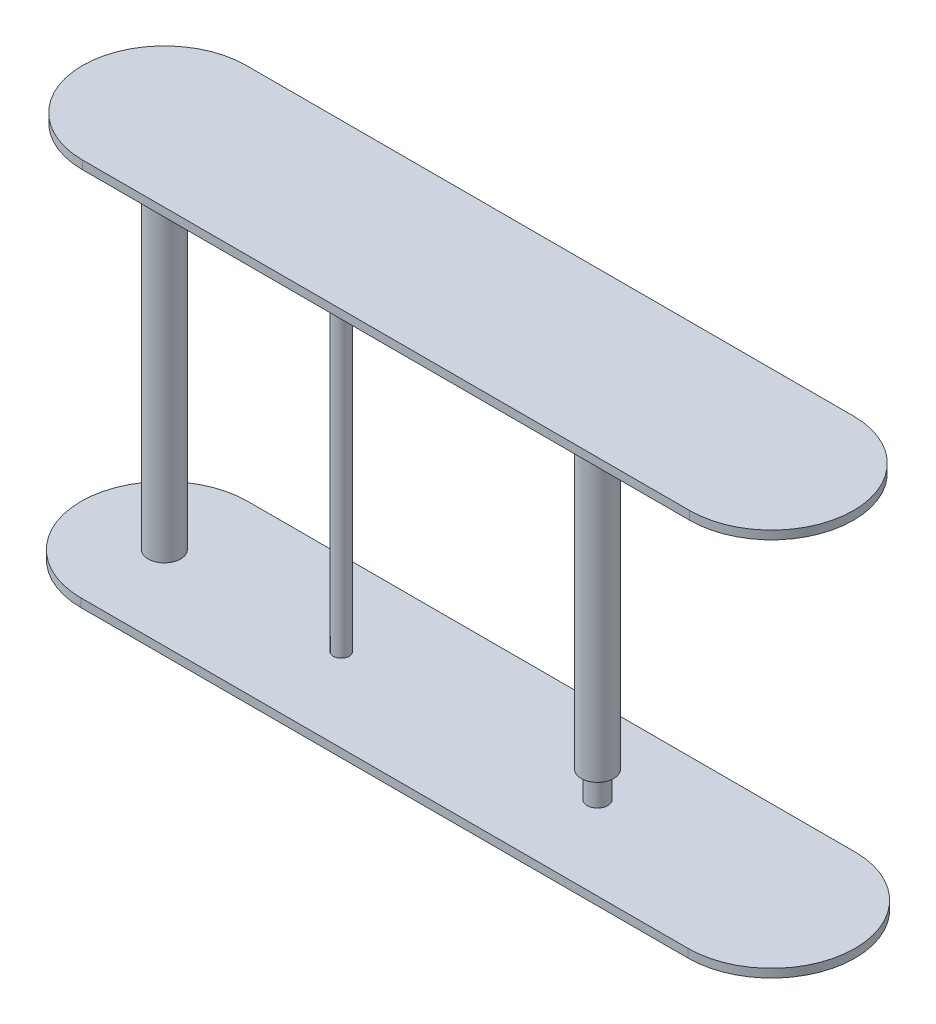
ISO-10303-21;
HEADER;
FILE_DESCRIPTION(('STEP AP214'),'2;1');
FILE_NAME('part.step','',(''),(''),'','','');
FILE_SCHEMA(('AUTOMOTIVE_DESIGN { 1 0 10303 214 1 1 1 1 }'));
ENDSEC;
DATA;
#1=APPLICATION_CONTEXT('core data for automotive mechanical design processes');
#2=APPLICATION_PROTOCOL_DEFINITION('international standard','automotive_design',2000,#1);
#3=PRODUCT_CONTEXT('',#1,'mechanical');
#4=PRODUCT('Part','Part','',(#3));
#5=PRODUCT_RELATED_PRODUCT_CATEGORY('part','',(#4));
#6=PRODUCT_DEFINITION_FORMATION('','',#4);
#7=PRODUCT_DEFINITION_CONTEXT('part definition',#1,'design');
#8=PRODUCT_DEFINITION('design','',#6,#7);
#9=PRODUCT_DEFINITION_SHAPE('','',#8);
#10=(LENGTH_UNIT() NAMED_UNIT(*) SI_UNIT(.MILLI.,.METRE.));
#11=(NAMED_UNIT(*) PLANE_ANGLE_UNIT() SI_UNIT($,.RADIAN.));
#12=(NAMED_UNIT(*) SI_UNIT($,.STERADIAN.) SOLID_ANGLE_UNIT());
#13=UNCERTAINTY_MEASURE_WITH_UNIT(LENGTH_MEASURE(1.E-05),#10,'distance_accuracy_value','');
#14=(GEOMETRIC_REPRESENTATION_CONTEXT(3) GLOBAL_UNCERTAINTY_ASSIGNED_CONTEXT((#13)) GLOBAL_UNIT_ASSIGNED_CONTEXT((#10,
#11,#12)) REPRESENTATION_CONTEXT('',''));
#15=CARTESIAN_POINT('',(0.,0.,0.));
#16=DIRECTION('',(0.,0.,1.));
#17=DIRECTION('',(1.,0.,0.));
#18=AXIS2_PLACEMENT_3D('',#15,#16,#17);
#19=CARTESIAN_POINT('',(-110.589063221043,3.2,0.));
#20=DIRECTION('',(0.,-1.,0.));
#21=DIRECTION('',(0.,0.,-1.));
#22=AXIS2_PLACEMENT_3D('',#19,#20,#21);
#23=CYLINDRICAL_SURFACE('',#22,31.6);
#24=CARTESIAN_POINT('',(-110.589063221043,0.,0.));
#25=DIRECTION('',(0.,1.,0.));
#26=DIRECTION('',(0.,0.,1.));
#27=AXIS2_PLACEMENT_3D('',#24,#25,#26);
#28=CIRCLE('',#27,31.6);
#29=CARTESIAN_POINT('',(-110.589063221043,0.,-31.6));
#30=VERTEX_POINT('',#29);
#31=CARTESIAN_POINT('',(-110.589063221043,0.,31.6));
#32=VERTEX_POINT('',#31);
#33=EDGE_CURVE('E145',#30,#32,#28,.T.);
#34=ORIENTED_EDGE('',*,*,#33,.T.);
#35=DIRECTION('',(0.,-1.,0.));
#36=VECTOR('',#35,1.);
#37=CARTESIAN_POINT('',(-110.589063221043,3.2,31.6));
#38=LINE('',#37,#36);
#39=CARTESIAN_POINT('',(-110.589063221043,3.2,31.6));
#40=VERTEX_POINT('',#39);
#41=EDGE_CURVE('E43',#40,#32,#38,.T.);
#42=ORIENTED_EDGE('',*,*,#41,.F.);
#43=CARTESIAN_POINT('',(-110.589063221043,3.2,0.));
#44=DIRECTION('',(0.,1.,0.));
#45=DIRECTION('',(0.,0.,1.));
#46=AXIS2_PLACEMENT_3D('',#43,#44,#45);
#47=CIRCLE('',#46,31.6);
#48=CARTESIAN_POINT('',(-110.589063221043,3.2,-31.6));
#49=VERTEX_POINT('',#48);
#50=EDGE_CURVE('E147',#49,#40,#47,.T.);
#51=ORIENTED_EDGE('',*,*,#50,.F.);
#52=DIRECTION('',(0.,-1.,0.));
#53=VECTOR('',#52,1.);
#54=CARTESIAN_POINT('',(-110.589063221043,3.2,-31.6));
#55=LINE('',#54,#53);
#56=EDGE_CURVE('E153',#49,#30,#55,.T.);
#57=ORIENTED_EDGE('',*,*,#56,.T.);
#58=EDGE_LOOP('',(#34,#42,#51,#57));
#59=FACE_BOUND('',#58,.T.);
#60=ADVANCED_FACE('F35',(#59),#23,.T.);
#61=CARTESIAN_POINT('',(-110.589063221043,3.2,31.6));
#62=DIRECTION('',(0.,0.,-1.));
#63=DIRECTION('',(-1.,0.,0.));
#64=AXIS2_PLACEMENT_3D('',#61,#62,#63);
#65=PLANE('',#64);
#66=DIRECTION('',(1.,0.,0.));
#67=VECTOR('',#66,1.);
#68=CARTESIAN_POINT('',(-110.589063221043,0.,31.6));
#69=LINE('',#68,#67);
#70=CARTESIAN_POINT('',(119.210936778957,0.,31.6));
#71=VERTEX_POINT('',#70);
#72=EDGE_CURVE('E156',#32,#71,#69,.T.);
#73=ORIENTED_EDGE('',*,*,#72,.T.);
#74=DIRECTION('',(0.,-1.,0.));
#75=VECTOR('',#74,1.);
#76=CARTESIAN_POINT('',(119.210936778957,3.2,31.6));
#77=LINE('',#76,#75);
#78=CARTESIAN_POINT('',(119.210936778957,3.2,31.6));
#79=VERTEX_POINT('',#78);
#80=EDGE_CURVE('E163',#79,#71,#77,.T.);
#81=ORIENTED_EDGE('',*,*,#80,.F.);
#82=DIRECTION('',(1.,0.,0.));
#83=VECTOR('',#82,1.);
#84=CARTESIAN_POINT('',(-110.589063221043,3.2,31.6));
#85=LINE('',#84,#83);
#86=EDGE_CURVE('E83',#40,#79,#85,.T.);
#87=ORIENTED_EDGE('',*,*,#86,.F.);
#88=ORIENTED_EDGE('',*,*,#41,.T.);
#89=EDGE_LOOP('',(#73,#81,#87,#88));
#90=FACE_BOUND('',#89,.T.);
#91=ADVANCED_FACE('F165',(#90),#65,.F.);
#92=CARTESIAN_POINT('',(119.210936778957,3.2,0.));
#93=DIRECTION('',(0.,-1.,0.));
#94=DIRECTION('',(0.,0.,-1.));
#95=AXIS2_PLACEMENT_3D('',#92,#93,#94);
#96=CYLINDRICAL_SURFACE('',#95,31.6);
#97=CARTESIAN_POINT('',(119.210936778957,0.,0.));
#98=DIRECTION('',(0.,1.,0.));
#99=DIRECTION('',(0.,0.,1.));
#100=AXIS2_PLACEMENT_3D('',#97,#98,#99);
#101=CIRCLE('',#100,31.6);
#102=CARTESIAN_POINT('',(119.210936778957,0.,-31.6));
#103=VERTEX_POINT('',#102);
#104=EDGE_CURVE('E69',#71,#103,#101,.T.);
#105=ORIENTED_EDGE('',*,*,#104,.T.);
#106=DIRECTION('',(0.,-1.,0.));
#107=VECTOR('',#106,1.);
#108=CARTESIAN_POINT('',(119.210936778957,3.2,-31.6));
#109=LINE('',#108,#107);
#110=CARTESIAN_POINT('',(119.210936778957,3.2,-31.6));
#111=VERTEX_POINT('',#110);
#112=EDGE_CURVE('E161',#111,#103,#109,.T.);
#113=ORIENTED_EDGE('',*,*,#112,.F.);
#114=CARTESIAN_POINT('',(119.210936778957,3.2,0.));
#115=DIRECTION('',(0.,1.,0.));
#116=DIRECTION('',(0.,0.,1.));
#117=AXIS2_PLACEMENT_3D('',#114,#115,#116);
#118=CIRCLE('',#117,31.6);
#119=EDGE_CURVE('E150',#79,#111,#118,.T.);
#120=ORIENTED_EDGE('',*,*,#119,.F.);
#121=ORIENTED_EDGE('',*,*,#80,.T.);
#122=EDGE_LOOP('',(#105,#113,#120,#121));
#123=FACE_BOUND('',#122,.T.);
#124=ADVANCED_FACE('F189',(#123),#96,.T.);
#125=CARTESIAN_POINT('',(-110.589063221043,3.2,-31.6));
#126=DIRECTION('',(0.,0.,1.));
#127=DIRECTION('',(1.,0.,0.));
#128=AXIS2_PLACEMENT_3D('',#125,#126,#127);
#129=PLANE('',#128);
#130=DIRECTION('',(-1.,0.,0.));
#131=VECTOR('',#130,1.);
#132=CARTESIAN_POINT('',(-110.589063221043,0.,-31.6));
#133=LINE('',#132,#131);
#134=EDGE_CURVE('E75',#103,#30,#133,.T.);
#135=ORIENTED_EDGE('',*,*,#134,.T.);
#136=ORIENTED_EDGE('',*,*,#56,.F.);
#137=DIRECTION('',(-1.,0.,0.));
#138=VECTOR('',#137,1.);
#139=CARTESIAN_POINT('',(-110.589063221043,3.2,-31.6));
#140=LINE('',#139,#138);
#141=EDGE_CURVE('E51',#111,#49,#140,.T.);
#142=ORIENTED_EDGE('',*,*,#141,.F.);
#143=ORIENTED_EDGE('',*,*,#112,.T.);
#144=EDGE_LOOP('',(#135,#136,#142,#143));
#145=FACE_BOUND('',#144,.T.);
#146=ADVANCED_FACE('F181',(#145),#129,.F.);
#147=CARTESIAN_POINT('',(-110.589063221043,3.2,0.));
#148=DIRECTION('',(0.,1.,0.));
#149=DIRECTION('',(0.,0.,1.));
#150=AXIS2_PLACEMENT_3D('',#147,#148,#149);
#151=PLANE('',#150);
#152=CARTESIAN_POINT('',(53.3109367789571,3.2,0.));
#153=DIRECTION('',(0.,1.,0.));
#154=DIRECTION('',(0.,0.,1.));
#155=AXIS2_PLACEMENT_3D('',#152,#153,#154);
#156=CIRCLE('',#155,3.9);
#157=CARTESIAN_POINT('',(53.3109367789571,3.2,3.9));
#158=VERTEX_POINT('',#157);
#159=EDGE_CURVE('E353',#158,#158,#156,.T.);
#160=ORIENTED_EDGE('',*,*,#159,.F.);
#161=EDGE_LOOP('',(#160));
#162=FACE_BOUND('',#161,.T.);
#163=CARTESIAN_POINT('',(-43.6390632210429,3.2,0.));
#164=DIRECTION('',(0.,1.,0.));
#165=DIRECTION('',(0.,0.,1.));
#166=AXIS2_PLACEMENT_3D('',#163,#164,#165);
#167=CIRCLE('',#166,3.00000000000001);
#168=CARTESIAN_POINT('',(-43.6390632210429,3.2,3.00000000000002));
#169=VERTEX_POINT('',#168);
#170=EDGE_CURVE('E346',#169,#169,#167,.T.);
#171=ORIENTED_EDGE('',*,*,#170,.F.);
#172=EDGE_LOOP('',(#171));
#173=FACE_BOUND('',#172,.T.);
#174=CARTESIAN_POINT('',(-110.589063221043,3.2,0.));
#175=DIRECTION('',(0.,1.,0.));
#176=DIRECTION('',(0.,0.,1.));
#177=AXIS2_PLACEMENT_3D('',#174,#175,#176);
#178=CIRCLE('',#177,6.15000000000001);
#179=CARTESIAN_POINT('',(-110.589063221043,3.2,6.15000000000001));
#180=VERTEX_POINT('',#179);
#181=EDGE_CURVE('E135',#180,#180,#178,.T.);
#182=ORIENTED_EDGE('',*,*,#181,.F.);
#183=EDGE_LOOP('',(#182));
#184=FACE_BOUND('',#183,.T.);
#185=ORIENTED_EDGE('',*,*,#50,.T.);
#186=ORIENTED_EDGE('',*,*,#86,.T.);
#187=ORIENTED_EDGE('',*,*,#119,.T.);
#188=ORIENTED_EDGE('',*,*,#141,.T.);
#189=EDGE_LOOP('',(#185,#186,#187,#188));
#190=FACE_BOUND('',#189,.T.);
#191=ADVANCED_FACE('F173',(#162,#173,#184,#190),#151,.T.);
#192=CARTESIAN_POINT('',(-110.589063221043,0.,0.));
#193=DIRECTION('',(0.,1.,0.));
#194=DIRECTION('',(0.,0.,1.));
#195=AXIS2_PLACEMENT_3D('',#192,#193,#194);
#196=PLANE('',#195);
#197=ORIENTED_EDGE('',*,*,#33,.F.);
#198=ORIENTED_EDGE('',*,*,#134,.F.);
#199=ORIENTED_EDGE('',*,*,#104,.F.);
#200=ORIENTED_EDGE('',*,*,#72,.F.);
#201=EDGE_LOOP('',(#197,#198,#199,#200));
#202=FACE_BOUND('',#201,.T.);
#203=ADVANCED_FACE('F170',(#202),#196,.F.);
#204=CARTESIAN_POINT('',(-110.589063221043,143.2,0.));
#205=DIRECTION('',(0.,-1.,0.));
#206=DIRECTION('',(0.,0.,-1.));
#207=AXIS2_PLACEMENT_3D('',#204,#205,#206);
#208=CYLINDRICAL_SURFACE('',#207,6.15000000000001);
#209=CARTESIAN_POINT('',(-110.589063221043,143.2,0.));
#210=DIRECTION('',(0.,1.,0.));
#211=DIRECTION('',(0.,0.,1.));
#212=AXIS2_PLACEMENT_3D('',#209,#210,#211);
#213=CIRCLE('',#212,6.15000000000001);
#214=CARTESIAN_POINT('',(-110.589063221043,143.2,6.15000000000001));
#215=VERTEX_POINT('',#214);
#216=EDGE_CURVE('E138',#215,#215,#213,.T.);
#217=ORIENTED_EDGE('',*,*,#216,.F.);
#218=EDGE_LOOP('',(#217));
#219=FACE_BOUND('',#218,.T.);
#220=ORIENTED_EDGE('',*,*,#181,.T.);
#221=EDGE_LOOP('',(#220));
#222=FACE_BOUND('',#221,.T.);
#223=ADVANCED_FACE('F172',(#219,#222),#208,.T.);
#224=CARTESIAN_POINT('',(-110.589063221043,146.4,0.));
#225=DIRECTION('',(0.,-1.,0.));
#226=DIRECTION('',(0.,0.,-1.));
#227=AXIS2_PLACEMENT_3D('',#224,#225,#226);
#228=CYLINDRICAL_SURFACE('',#227,30.9881937080235);
#229=CARTESIAN_POINT('',(-110.589063221043,143.2,0.));
#230=DIRECTION('',(0.,1.,0.));
#231=DIRECTION('',(0.,0.,1.));
#232=AXIS2_PLACEMENT_3D('',#229,#230,#231);
#233=CIRCLE('',#232,30.9881937080235);
#234=CARTESIAN_POINT('',(-110.589063221043,143.2,-30.9881937080235));
#235=VERTEX_POINT('',#234);
#236=CARTESIAN_POINT('',(-110.589063221043,143.2,30.9881937080235));
#237=VERTEX_POINT('',#236);
#238=EDGE_CURVE('E134',#235,#237,#233,.T.);
#239=ORIENTED_EDGE('',*,*,#238,.T.);
#240=DIRECTION('',(0.,-1.,0.));
#241=VECTOR('',#240,1.);
#242=CARTESIAN_POINT('',(-110.589063221043,146.4,30.9881937080235));
#243=LINE('',#242,#241);
#244=CARTESIAN_POINT('',(-110.589063221043,146.4,30.9881937080235));
#245=VERTEX_POINT('',#244);
#246=EDGE_CURVE('E114',#245,#237,#243,.T.);
#247=ORIENTED_EDGE('',*,*,#246,.F.);
#248=CARTESIAN_POINT('',(-110.589063221043,146.4,0.));
#249=DIRECTION('',(0.,1.,0.));
#250=DIRECTION('',(0.,0.,1.));
#251=AXIS2_PLACEMENT_3D('',#248,#249,#250);
#252=CIRCLE('',#251,30.9881937080235);
#253=CARTESIAN_POINT('',(-110.589063221043,146.4,-30.9881937080235));
#254=VERTEX_POINT('',#253);
#255=EDGE_CURVE('E121',#254,#245,#252,.T.);
#256=ORIENTED_EDGE('',*,*,#255,.F.);
#257=DIRECTION('',(0.,-1.,0.));
#258=VECTOR('',#257,1.);
#259=CARTESIAN_POINT('',(-110.589063221043,146.4,-30.9881937080235));
#260=LINE('',#259,#258);
#261=EDGE_CURVE('E339',#254,#235,#260,.T.);
#262=ORIENTED_EDGE('',*,*,#261,.T.);
#263=EDGE_LOOP('',(#239,#247,#256,#262));
#264=FACE_BOUND('',#263,.T.);
#265=ADVANCED_FACE('F132',(#264),#228,.T.);
#266=CARTESIAN_POINT('',(-110.589063221043,146.4,30.9881937080235));
#267=DIRECTION('',(0.,0.,-1.));
#268=DIRECTION('',(-1.,0.,0.));
#269=AXIS2_PLACEMENT_3D('',#266,#267,#268);
#270=PLANE('',#269);
#271=DIRECTION('',(1.,0.,0.));
#272=VECTOR('',#271,1.);
#273=CARTESIAN_POINT('',(-110.589063221043,143.2,30.9881937080235));
#274=LINE('',#273,#272);
#275=CARTESIAN_POINT('',(119.210936778957,143.2,30.9881937080235));
#276=VERTEX_POINT('',#275);
#277=EDGE_CURVE('E337',#237,#276,#274,.T.);
#278=ORIENTED_EDGE('',*,*,#277,.T.);
#279=DIRECTION('',(0.,-1.,0.));
#280=VECTOR('',#279,1.);
#281=CARTESIAN_POINT('',(119.210936778957,146.4,30.9881937080235));
#282=LINE('',#281,#280);
#283=CARTESIAN_POINT('',(119.210936778957,146.4,30.9881937080235));
#284=VERTEX_POINT('',#283);
#285=EDGE_CURVE('E117',#284,#276,#282,.T.);
#286=ORIENTED_EDGE('',*,*,#285,.F.);
#287=DIRECTION('',(1.,0.,0.));
#288=VECTOR('',#287,1.);
#289=CARTESIAN_POINT('',(-110.589063221043,146.4,30.9881937080235));
#290=LINE('',#289,#288);
#291=EDGE_CURVE('E110',#245,#284,#290,.T.);
#292=ORIENTED_EDGE('',*,*,#291,.F.);
#293=ORIENTED_EDGE('',*,*,#246,.T.);
#294=EDGE_LOOP('',(#278,#286,#292,#293));
#295=FACE_BOUND('',#294,.T.);
#296=ADVANCED_FACE('F112',(#295),#270,.F.);
#297=CARTESIAN_POINT('',(119.210936778957,146.4,0.));
#298=DIRECTION('',(0.,-1.,0.));
#299=DIRECTION('',(0.,0.,-1.));
#300=AXIS2_PLACEMENT_3D('',#297,#298,#299);
#301=CYLINDRICAL_SURFACE('',#300,30.9881937080235);
#302=CARTESIAN_POINT('',(119.210936778957,143.2,0.));
#303=DIRECTION('',(0.,1.,0.));
#304=DIRECTION('',(0.,0.,1.));
#305=AXIS2_PLACEMENT_3D('',#302,#303,#304);
#306=CIRCLE('',#305,30.9881937080235);
#307=CARTESIAN_POINT('',(119.210936778957,143.2,-30.9881937080235));
#308=VERTEX_POINT('',#307);
#309=EDGE_CURVE('E333',#276,#308,#306,.T.);
#310=ORIENTED_EDGE('',*,*,#309,.T.);
#311=DIRECTION('',(0.,-1.,0.));
#312=VECTOR('',#311,1.);
#313=CARTESIAN_POINT('',(119.210936778957,146.4,-30.9881937080235));
#314=LINE('',#313,#312);
#315=CARTESIAN_POINT('',(119.210936778957,146.4,-30.9881937080235));
#316=VERTEX_POINT('',#315);
#317=EDGE_CURVE('E140',#316,#308,#314,.T.);
#318=ORIENTED_EDGE('',*,*,#317,.F.);
#319=CARTESIAN_POINT('',(119.210936778957,146.4,0.));
#320=DIRECTION('',(0.,1.,0.));
#321=DIRECTION('',(0.,0.,1.));
#322=AXIS2_PLACEMENT_3D('',#319,#320,#321);
#323=CIRCLE('',#322,30.9881937080235);
#324=EDGE_CURVE('E120',#284,#316,#323,.T.);
#325=ORIENTED_EDGE('',*,*,#324,.F.);
#326=ORIENTED_EDGE('',*,*,#285,.T.);
#327=EDGE_LOOP('',(#310,#318,#325,#326));
#328=FACE_BOUND('',#327,.T.);
#329=ADVANCED_FACE('F286',(#328),#301,.T.);
#330=CARTESIAN_POINT('',(-110.589063221043,146.4,-30.9881937080235));
#331=DIRECTION('',(0.,0.,1.));
#332=DIRECTION('',(1.,0.,0.));
#333=AXIS2_PLACEMENT_3D('',#330,#331,#332);
#334=PLANE('',#333);
#335=DIRECTION('',(-1.,0.,0.));
#336=VECTOR('',#335,1.);
#337=CARTESIAN_POINT('',(-110.589063221043,143.2,-30.9881937080235));
#338=LINE('',#337,#336);
#339=EDGE_CURVE('E130',#308,#235,#338,.T.);
#340=ORIENTED_EDGE('',*,*,#339,.T.);
#341=ORIENTED_EDGE('',*,*,#261,.F.);
#342=DIRECTION('',(-1.,0.,0.));
#343=VECTOR('',#342,1.);
#344=CARTESIAN_POINT('',(-110.589063221043,146.4,-30.9881937080235));
#345=LINE('',#344,#343);
#346=EDGE_CURVE('E126',#316,#254,#345,.T.);
#347=ORIENTED_EDGE('',*,*,#346,.F.);
#348=ORIENTED_EDGE('',*,*,#317,.T.);
#349=EDGE_LOOP('',(#340,#341,#347,#348));
#350=FACE_BOUND('',#349,.T.);
#351=ADVANCED_FACE('F282',(#350),#334,.F.);
#352=CARTESIAN_POINT('',(-110.589063221043,146.4,0.));
#353=DIRECTION('',(0.,1.,0.));
#354=DIRECTION('',(0.,0.,1.));
#355=AXIS2_PLACEMENT_3D('',#352,#353,#354);
#356=PLANE('',#355);
#357=ORIENTED_EDGE('',*,*,#255,.T.);
#358=ORIENTED_EDGE('',*,*,#291,.T.);
#359=ORIENTED_EDGE('',*,*,#324,.T.);
#360=ORIENTED_EDGE('',*,*,#346,.T.);
#361=EDGE_LOOP('',(#357,#358,#359,#360));
#362=FACE_BOUND('',#361,.T.);
#363=ADVANCED_FACE('F124',(#362),#356,.T.);
#364=CARTESIAN_POINT('',(-110.589063221043,143.2,0.));
#365=DIRECTION('',(0.,1.,0.));
#366=DIRECTION('',(0.,0.,1.));
#367=AXIS2_PLACEMENT_3D('',#364,#365,#366);
#368=PLANE('',#367);
#369=CARTESIAN_POINT('',(53.3109367789571,143.2,0.));
#370=DIRECTION('',(0.,1.,0.));
#371=DIRECTION('',(0.,0.,1.));
#372=AXIS2_PLACEMENT_3D('',#369,#370,#371);
#373=CIRCLE('',#372,3.9);
#374=CARTESIAN_POINT('',(53.3109367789571,143.2,3.9));
#375=VERTEX_POINT('',#374);
#376=EDGE_CURVE('E361',#375,#375,#373,.T.);
#377=ORIENTED_EDGE('',*,*,#376,.T.);
#378=EDGE_LOOP('',(#377));
#379=FACE_BOUND('',#378,.T.);
#380=CARTESIAN_POINT('',(-43.6390632210429,143.2,0.));
#381=DIRECTION('',(0.,1.,0.));
#382=DIRECTION('',(0.,0.,1.));
#383=AXIS2_PLACEMENT_3D('',#380,#381,#382);
#384=CIRCLE('',#383,3.00000000000001);
#385=CARTESIAN_POINT('',(-43.6390632210429,143.2,3.00000000000002));
#386=VERTEX_POINT('',#385);
#387=EDGE_CURVE('E11',#386,#386,#384,.F.);
#388=ORIENTED_EDGE('',*,*,#387,.F.);
#389=EDGE_LOOP('',(#388));
#390=FACE_BOUND('',#389,.T.);
#391=ORIENTED_EDGE('',*,*,#216,.T.);
#392=EDGE_LOOP('',(#391));
#393=FACE_BOUND('',#392,.T.);
#394=ORIENTED_EDGE('',*,*,#238,.F.);
#395=ORIENTED_EDGE('',*,*,#339,.F.);
#396=ORIENTED_EDGE('',*,*,#309,.F.);
#397=ORIENTED_EDGE('',*,*,#277,.F.);
#398=EDGE_LOOP('',(#394,#395,#396,#397));
#399=FACE_BOUND('',#398,.T.);
#400=ADVANCED_FACE('F241',(#379,#390,#393,#399),#368,.F.);
#401=CARTESIAN_POINT('',(-43.6390632210429,143.2,0.));
#402=DIRECTION('',(0.,-1.,0.));
#403=DIRECTION('',(0.,0.,-1.));
#404=AXIS2_PLACEMENT_3D('',#401,#402,#403);
#405=CYLINDRICAL_SURFACE('',#404,3.00000000000001);
#406=ORIENTED_EDGE('',*,*,#387,.T.);
#407=EDGE_LOOP('',(#406));
#408=FACE_BOUND('',#407,.T.);
#409=ORIENTED_EDGE('',*,*,#170,.T.);
#410=EDGE_LOOP('',(#409));
#411=FACE_BOUND('',#410,.T.);
#412=ADVANCED_FACE('F210',(#408,#411),#405,.T.);
#413=CARTESIAN_POINT('',(53.3109367789571,13.2,0.));
#414=DIRECTION('',(0.,-1.,0.));
#415=DIRECTION('',(0.,0.,-1.));
#416=AXIS2_PLACEMENT_3D('',#413,#414,#415);
#417=CYLINDRICAL_SURFACE('',#416,3.9);
#418=CARTESIAN_POINT('',(53.3109367789571,13.2,0.));
#419=DIRECTION('',(0.,1.,0.));
#420=DIRECTION('',(0.,0.,1.));
#421=AXIS2_PLACEMENT_3D('',#418,#419,#420);
#422=CIRCLE('',#421,3.9);
#423=CARTESIAN_POINT('',(53.3109367789571,13.2,3.9));
#424=VERTEX_POINT('',#423);
#425=EDGE_CURVE('E348',#424,#424,#422,.T.);
#426=ORIENTED_EDGE('',*,*,#425,.F.);
#427=EDGE_LOOP('',(#426));
#428=FACE_BOUND('',#427,.T.);
#429=ORIENTED_EDGE('',*,*,#159,.T.);
#430=EDGE_LOOP('',(#429));
#431=FACE_BOUND('',#430,.T.);
#432=ADVANCED_FACE('F215',(#428,#431),#417,.T.);
#433=CARTESIAN_POINT('',(53.3109367789571,73.2,0.));
#434=DIRECTION('',(0.,-1.,0.));
#435=DIRECTION('',(0.,0.,-1.));
#436=AXIS2_PLACEMENT_3D('',#433,#434,#435);
#437=CYLINDRICAL_SURFACE('',#436,6.15);
#438=CARTESIAN_POINT('',(53.3109367789571,13.2,0.));
#439=DIRECTION('',(0.,1.,0.));
#440=DIRECTION('',(0.,0.,1.));
#441=AXIS2_PLACEMENT_3D('',#438,#439,#440);
#442=CIRCLE('',#441,6.15);
#443=CARTESIAN_POINT('',(53.3109367789571,13.2,6.15));
#444=VERTEX_POINT('',#443);
#445=EDGE_CURVE('E357',#444,#444,#442,.T.);
#446=ORIENTED_EDGE('',*,*,#445,.T.);
#447=EDGE_LOOP('',(#446));
#448=FACE_BOUND('',#447,.T.);
#449=CARTESIAN_POINT('',(53.3109367789571,133.2,0.));
#450=DIRECTION('',(0.,1.,0.));
#451=DIRECTION('',(0.,0.,1.));
#452=AXIS2_PLACEMENT_3D('',#449,#450,#451);
#453=CIRCLE('',#452,6.15);
#454=CARTESIAN_POINT('',(53.3109367789571,133.2,6.15));
#455=VERTEX_POINT('',#454);
#456=EDGE_CURVE('E367',#455,#455,#453,.T.);
#457=ORIENTED_EDGE('',*,*,#456,.F.);
#458=EDGE_LOOP('',(#457));
#459=FACE_BOUND('',#458,.T.);
#460=ADVANCED_FACE('F220',(#448,#459),#437,.T.);
#461=CARTESIAN_POINT('',(53.3109367789571,13.2,0.));
#462=DIRECTION('',(0.,1.,0.));
#463=DIRECTION('',(0.,0.,1.));
#464=AXIS2_PLACEMENT_3D('',#461,#462,#463);
#465=PLANE('',#464);
#466=ORIENTED_EDGE('',*,*,#425,.T.);
#467=EDGE_LOOP('',(#466));
#468=FACE_BOUND('',#467,.T.);
#469=ORIENTED_EDGE('',*,*,#445,.F.);
#470=EDGE_LOOP('',(#469));
#471=FACE_BOUND('',#470,.T.);
#472=ADVANCED_FACE('F228',(#468,#471),#465,.F.);
#473=CARTESIAN_POINT('',(53.3109367789571,133.2,0.));
#474=DIRECTION('',(0.,1.,0.));
#475=DIRECTION('',(0.,0.,1.));
#476=AXIS2_PLACEMENT_3D('',#473,#474,#475);
#477=CYLINDRICAL_SURFACE('',#476,3.9);
#478=CARTESIAN_POINT('',(53.3109367789571,133.2,0.));
#479=DIRECTION('',(0.,1.,0.));
#480=DIRECTION('',(0.,0.,1.));
#481=AXIS2_PLACEMENT_3D('',#478,#479,#480);
#482=CIRCLE('',#481,3.9);
#483=CARTESIAN_POINT('',(53.3109367789571,133.2,3.9));
#484=VERTEX_POINT('',#483);
#485=EDGE_CURVE('E364',#484,#484,#482,.T.);
#486=ORIENTED_EDGE('',*,*,#485,.T.);
#487=EDGE_LOOP('',(#486));
#488=FACE_BOUND('',#487,.T.);
#489=ORIENTED_EDGE('',*,*,#376,.F.);
#490=EDGE_LOOP('',(#489));
#491=FACE_BOUND('',#490,.T.);
#492=ADVANCED_FACE('F233',(#488,#491),#477,.T.);
#493=CARTESIAN_POINT('',(53.3109367789571,133.2,0.));
#494=DIRECTION('',(0.,-1.,0.));
#495=DIRECTION('',(0.,0.,1.));
#496=AXIS2_PLACEMENT_3D('',#493,#494,#495);
#497=PLANE('',#496);
#498=ORIENTED_EDGE('',*,*,#485,.F.);
#499=EDGE_LOOP('',(#498));
#500=FACE_BOUND('',#499,.T.);
#501=ORIENTED_EDGE('',*,*,#456,.T.);
#502=EDGE_LOOP('',(#501));
#503=FACE_BOUND('',#502,.T.);
#504=ADVANCED_FACE('F264',(#500,#503),#497,.F.);
#505=CLOSED_SHELL('',(#60,#91,#124,#146,#191,#203,#223,#265,#296,#329,#351,#363,#400,#412,#432,
#460,#472,#492,#504));
#506=MANIFOLD_SOLID_BREP('B2',#505);
#507=ADVANCED_BREP_SHAPE_REPRESENTATION('',(#18,#506),#14);
#508=SHAPE_DEFINITION_REPRESENTATION(#9,#507);
ENDSEC;
END-ISO-10303-21;
